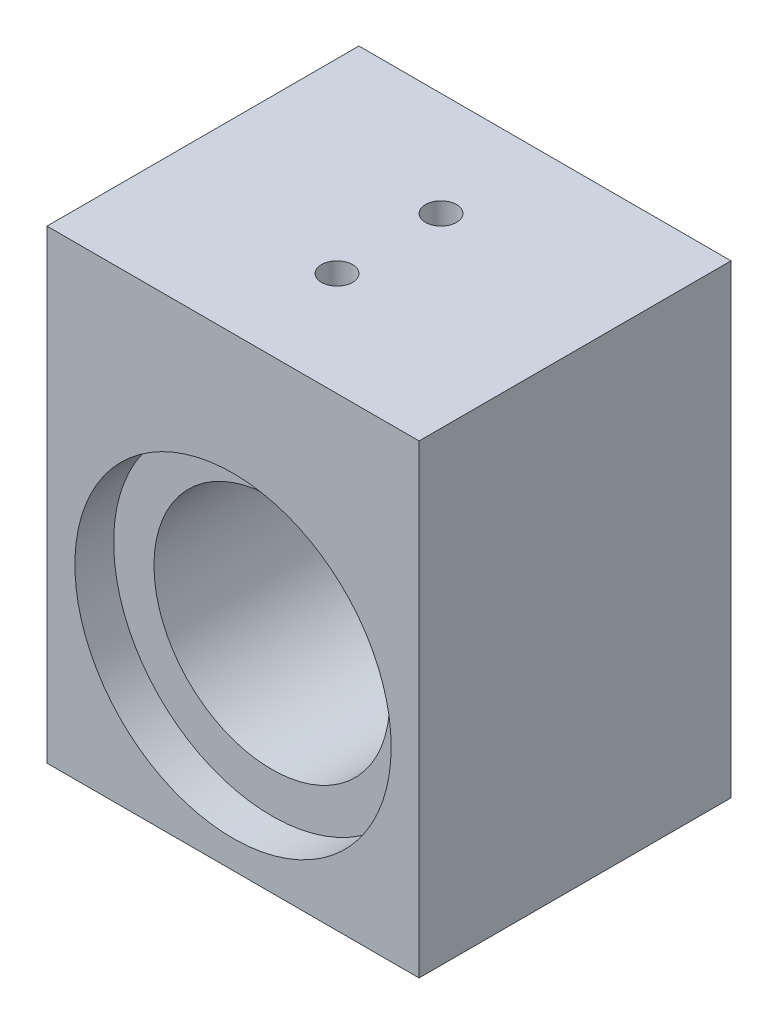
ISO-10303-21;
HEADER;
FILE_DESCRIPTION(('STEP AP214'),'2;1');
FILE_NAME('part.step','',(''),(''),'','','');
FILE_SCHEMA(('AUTOMOTIVE_DESIGN { 1 0 10303 214 1 1 1 1 }'));
ENDSEC;
DATA;
#1=APPLICATION_CONTEXT('core data for automotive mechanical design processes');
#2=APPLICATION_PROTOCOL_DEFINITION('international standard','automotive_design',2000,#1);
#3=PRODUCT_CONTEXT('',#1,'mechanical');
#4=PRODUCT('Part','Part','',(#3));
#5=PRODUCT_RELATED_PRODUCT_CATEGORY('part','',(#4));
#6=PRODUCT_DEFINITION_FORMATION('','',#4);
#7=PRODUCT_DEFINITION_CONTEXT('part definition',#1,'design');
#8=PRODUCT_DEFINITION('design','',#6,#7);
#9=PRODUCT_DEFINITION_SHAPE('','',#8);
#10=(LENGTH_UNIT() NAMED_UNIT(*) SI_UNIT(.MILLI.,.METRE.));
#11=(NAMED_UNIT(*) PLANE_ANGLE_UNIT() SI_UNIT($,.RADIAN.));
#12=(NAMED_UNIT(*) SI_UNIT($,.STERADIAN.) SOLID_ANGLE_UNIT());
#13=UNCERTAINTY_MEASURE_WITH_UNIT(LENGTH_MEASURE(1.E-05),#10,'distance_accuracy_value','');
#14=(GEOMETRIC_REPRESENTATION_CONTEXT(3) GLOBAL_UNCERTAINTY_ASSIGNED_CONTEXT((#13)) GLOBAL_UNIT_ASSIGNED_CONTEXT((#10,
#11,#12)) REPRESENTATION_CONTEXT('',''));
#15=CARTESIAN_POINT('',(0.,0.,0.));
#16=DIRECTION('',(0.,0.,1.));
#17=DIRECTION('',(1.,0.,0.));
#18=AXIS2_PLACEMENT_3D('',#15,#16,#17);
#19=CARTESIAN_POINT('',(7.62,7.62,-13.6499893040251));
#20=DIRECTION('',(0.,0.,1.));
#21=DIRECTION('',(1.,0.,0.));
#22=AXIS2_PLACEMENT_3D('',#19,#20,#21);
#23=CYLINDRICAL_SURFACE('',#22,4.826);
#24=CARTESIAN_POINT('',(7.62,7.62,3.175));
#25=DIRECTION('',(0.,0.,-1.));
#26=DIRECTION('',(-1.,0.,0.));
#27=AXIS2_PLACEMENT_3D('',#24,#25,#26);
#28=CIRCLE('',#27,4.826);
#29=CARTESIAN_POINT('',(12.446,7.62,3.175));
#30=VERTEX_POINT('',#29);
#31=EDGE_CURVE('E120',#30,#30,#28,.F.);
#32=CARTESIAN_POINT('',(7.62,7.62,11.1887));
#33=DIRECTION('',(0.,0.,1.));
#34=DIRECTION('',(1.,0.,0.));
#35=AXIS2_PLACEMENT_3D('',#32,#33,#34);
#36=CIRCLE('',#35,4.826);
#37=CARTESIAN_POINT('',(12.446,7.62,11.1887));
#38=VERTEX_POINT('',#37);
#39=EDGE_CURVE('E38',#38,#38,#36,.F.);
#40=CARTESIAN_POINT('',(12.446,7.62,3.175));
#41=CARTESIAN_POINT('',(12.446,7.62,3.25847604166667));
#42=CARTESIAN_POINT('',(12.446,7.62,3.34195208333333));
#43=CARTESIAN_POINT('',(12.446,7.62,3.50890416666667));
#44=CARTESIAN_POINT('',(12.446,7.62,3.59238020833333));
#45=CARTESIAN_POINT('',(12.446,7.62,3.75933229166667));
#46=CARTESIAN_POINT('',(12.446,7.62,3.84280833333333));
#47=CARTESIAN_POINT('',(12.446,7.62,4.00976041666667));
#48=CARTESIAN_POINT('',(12.446,7.62,4.09323645833333));
#49=CARTESIAN_POINT('',(12.446,7.62,4.26018854166667));
#50=CARTESIAN_POINT('',(12.446,7.62,4.34366458333333));
#51=CARTESIAN_POINT('',(12.446,7.62,4.51061666666666));
#52=CARTESIAN_POINT('',(12.446,7.62,4.59409270833333));
#53=CARTESIAN_POINT('',(12.446,7.62,4.76104479166666));
#54=CARTESIAN_POINT('',(12.446,7.62,4.84452083333333));
#55=CARTESIAN_POINT('',(12.446,7.62,5.01147291666666));
#56=CARTESIAN_POINT('',(12.446,7.62,5.09494895833333));
#57=CARTESIAN_POINT('',(12.446,7.62,5.26190104166666));
#58=CARTESIAN_POINT('',(12.446,7.62,5.34537708333333));
#59=CARTESIAN_POINT('',(12.446,7.62,5.51232916666667));
#60=CARTESIAN_POINT('',(12.446,7.62,5.59580520833333));
#61=CARTESIAN_POINT('',(12.446,7.62,5.76275729166667));
#62=CARTESIAN_POINT('',(12.446,7.62,5.84623333333333));
#63=CARTESIAN_POINT('',(12.446,7.62,6.01318541666667));
#64=CARTESIAN_POINT('',(12.446,7.62,6.09666145833333));
#65=CARTESIAN_POINT('',(12.446,7.62,6.26361354166666));
#66=CARTESIAN_POINT('',(12.446,7.62,6.34708958333333));
#67=CARTESIAN_POINT('',(12.446,7.62,6.51404166666666));
#68=CARTESIAN_POINT('',(12.446,7.62,6.59751770833333));
#69=CARTESIAN_POINT('',(12.446,7.62,6.76446979166666));
#70=CARTESIAN_POINT('',(12.446,7.62,6.84794583333333));
#71=CARTESIAN_POINT('',(12.446,7.62,7.01489791666666));
#72=CARTESIAN_POINT('',(12.446,7.62,7.09837395833333));
#73=CARTESIAN_POINT('',(12.446,7.62,7.26532604166666));
#74=CARTESIAN_POINT('',(12.446,7.62,7.34880208333333));
#75=CARTESIAN_POINT('',(12.446,7.62,7.51575416666667));
#76=CARTESIAN_POINT('',(12.446,7.62,7.59923020833333));
#77=CARTESIAN_POINT('',(12.446,7.62,7.76618229166667));
#78=CARTESIAN_POINT('',(12.446,7.62,7.84965833333333));
#79=CARTESIAN_POINT('',(12.446,7.62,8.01661041666667));
#80=CARTESIAN_POINT('',(12.446,7.62,8.10008645833333));
#81=CARTESIAN_POINT('',(12.446,7.62,8.26703854166667));
#82=CARTESIAN_POINT('',(12.446,7.62,8.35051458333333));
#83=CARTESIAN_POINT('',(12.446,7.62,8.51746666666667));
#84=CARTESIAN_POINT('',(12.446,7.62,8.60094270833333));
#85=CARTESIAN_POINT('',(12.446,7.62,8.76789479166666));
#86=CARTESIAN_POINT('',(12.446,7.62,8.85137083333333));
#87=CARTESIAN_POINT('',(12.446,7.62,9.01832291666667));
#88=CARTESIAN_POINT('',(12.446,7.62,9.10179895833333));
#89=CARTESIAN_POINT('',(12.446,7.62,9.26875104166666));
#90=CARTESIAN_POINT('',(12.446,7.62,9.35222708333333));
#91=CARTESIAN_POINT('',(12.446,7.62,9.51917916666667));
#92=CARTESIAN_POINT('',(12.446,7.62,9.60265520833333));
#93=CARTESIAN_POINT('',(12.446,7.62,9.76960729166666));
#94=CARTESIAN_POINT('',(12.446,7.62,9.85308333333333));
#95=CARTESIAN_POINT('',(12.446,7.62,10.0200354166667));
#96=CARTESIAN_POINT('',(12.446,7.62,10.1035114583333));
#97=CARTESIAN_POINT('',(12.446,7.62,10.2704635416667));
#98=CARTESIAN_POINT('',(12.446,7.62,10.3539395833333));
#99=CARTESIAN_POINT('',(12.446,7.62,10.5208916666667));
#100=CARTESIAN_POINT('',(12.446,7.62,10.6043677083333));
#101=CARTESIAN_POINT('',(12.446,7.62,10.7713197916667));
#102=CARTESIAN_POINT('',(12.446,7.62,10.8547958333333));
#103=CARTESIAN_POINT('',(12.446,7.62,11.0217479166667));
#104=CARTESIAN_POINT('',(12.446,7.62,11.1052239583333));
#105=CARTESIAN_POINT('',(12.446,7.62,11.1887));
#106=B_SPLINE_CURVE_WITH_KNOTS('',3,(#40,#41,#42,#43,#44,#45,#46,#47,#48,#49,#50,#51,#52,#53,
#54,#55,#56,#57,#58,#59,#60,#61,#62,#63,#64,#65,#66,#67,#68,#69,#70,#71,#72,#73,#74,#75,#76,#77,
#78,#79,#80,#81,#82,#83,#84,#85,#86,#87,#88,#89,#90,#91,#92,#93,#94,#95,#96,#97,#98,#99,#100,
#101,#102,#103,#104,#105),.UNSPECIFIED.,.F.,.F.,(4,2,2,2,2,2,2,2,2,2,2,2,2,2,2,2,2,2,2,2,2,2,2,
2,2,2,2,2,2,2,2,2,4),(0.,0.250428125,0.500856250000001,0.751284375000001,1.0017125,1.252140625,
1.50256875,1.752996875,2.003425,2.253853125,2.50428125,2.754709375,3.0051375,3.255565625,
3.50599375,3.756421875,4.00685,4.257278125,4.50770625,4.758134375,5.0085625,5.258990625,
5.50941875,5.759846875,6.010275,6.260703125,6.51113125,6.761559375,7.0119875,7.262415625,
7.51284375,7.763271875,8.0137),.UNSPECIFIED.);
#107=EDGE_CURVE('BSEAM34',#30,#38,#106,.T.);
#108=ORIENTED_EDGE('',*,*,#31,.F.);
#109=ORIENTED_EDGE('',*,*,#39,.F.);
#110=ORIENTED_EDGE('',*,*,#107,.T.);
#111=ORIENTED_EDGE('',*,*,#107,.F.);
#112=EDGE_LOOP('',(#108,#110,#109,#111));
#113=FACE_BOUND('',#112,.T.);
#114=ADVANCED_FACE('F34',(#113),#23,.F.);
#115=CARTESIAN_POINT('',(0.,0.,12.7762));
#116=DIRECTION('',(0.,0.,-1.));
#117=DIRECTION('',(-1.,0.,0.));
#118=AXIS2_PLACEMENT_3D('',#115,#116,#117);
#119=PLANE('',#118);
#120=CARTESIAN_POINT('',(7.62,7.62,12.7762));
#121=DIRECTION('',(0.,0.,1.));
#122=DIRECTION('',(1.,0.,0.));
#123=AXIS2_PLACEMENT_3D('',#120,#121,#122);
#124=CIRCLE('',#123,6.477);
#125=CARTESIAN_POINT('',(14.097,7.62,12.7762));
#126=VERTEX_POINT('',#125);
#127=EDGE_CURVE('E123',#126,#126,#124,.T.);
#128=ORIENTED_EDGE('',*,*,#127,.F.);
#129=EDGE_LOOP('',(#128));
#130=FACE_BOUND('',#129,.T.);
#131=DIRECTION('',(0.,-1.,0.));
#132=VECTOR('',#131,1.);
#133=CARTESIAN_POINT('',(0.,0.,12.7762));
#134=LINE('',#133,#132);
#135=CARTESIAN_POINT('',(0.,19.05,12.7762));
#136=VERTEX_POINT('',#135);
#137=CARTESIAN_POINT('',(0.,0.,12.7762));
#138=VERTEX_POINT('',#137);
#139=EDGE_CURVE('E87',#136,#138,#134,.T.);
#140=ORIENTED_EDGE('',*,*,#139,.T.);
#141=DIRECTION('',(1.,0.,0.));
#142=VECTOR('',#141,1.);
#143=CARTESIAN_POINT('',(0.,0.,12.7762));
#144=LINE('',#143,#142);
#145=CARTESIAN_POINT('',(15.24,0.,12.7762));
#146=VERTEX_POINT('',#145);
#147=EDGE_CURVE('E82',#138,#146,#144,.T.);
#148=ORIENTED_EDGE('',*,*,#147,.T.);
#149=DIRECTION('',(0.,1.,0.));
#150=VECTOR('',#149,1.);
#151=CARTESIAN_POINT('',(15.24,0.,12.7762));
#152=LINE('',#151,#150);
#153=CARTESIAN_POINT('',(15.24,19.05,12.7762));
#154=VERTEX_POINT('',#153);
#155=EDGE_CURVE('E85',#146,#154,#152,.T.);
#156=ORIENTED_EDGE('',*,*,#155,.T.);
#157=DIRECTION('',(-1.,0.,0.));
#158=VECTOR('',#157,1.);
#159=CARTESIAN_POINT('',(0.,19.05,12.7762));
#160=LINE('',#159,#158);
#161=EDGE_CURVE('E52',#154,#136,#160,.T.);
#162=ORIENTED_EDGE('',*,*,#161,.T.);
#163=EDGE_LOOP('',(#140,#148,#156,#162));
#164=FACE_BOUND('',#163,.T.);
#165=ADVANCED_FACE('F83',(#130,#164),#119,.F.);
#166=CARTESIAN_POINT('',(0.,0.,0.));
#167=DIRECTION('',(0.,0.,-1.));
#168=DIRECTION('',(-1.,0.,0.));
#169=AXIS2_PLACEMENT_3D('',#166,#167,#168);
#170=PLANE('',#169);
#171=DIRECTION('',(0.,-1.,0.));
#172=VECTOR('',#171,1.);
#173=CARTESIAN_POINT('',(0.,0.,0.));
#174=LINE('',#173,#172);
#175=CARTESIAN_POINT('',(0.,19.05,0.));
#176=VERTEX_POINT('',#175);
#177=CARTESIAN_POINT('',(0.,0.,0.));
#178=VERTEX_POINT('',#177);
#179=EDGE_CURVE('E100',#176,#178,#174,.T.);
#180=ORIENTED_EDGE('',*,*,#179,.F.);
#181=DIRECTION('',(-1.,0.,0.));
#182=VECTOR('',#181,1.);
#183=CARTESIAN_POINT('',(0.,19.05,0.));
#184=LINE('',#183,#182);
#185=CARTESIAN_POINT('',(15.24,19.05,0.));
#186=VERTEX_POINT('',#185);
#187=EDGE_CURVE('E75',#186,#176,#184,.T.);
#188=ORIENTED_EDGE('',*,*,#187,.F.);
#189=DIRECTION('',(0.,1.,0.));
#190=VECTOR('',#189,1.);
#191=CARTESIAN_POINT('',(15.24,0.,0.));
#192=LINE('',#191,#190);
#193=CARTESIAN_POINT('',(15.24,0.,0.));
#194=VERTEX_POINT('',#193);
#195=EDGE_CURVE('E69',#194,#186,#192,.T.);
#196=ORIENTED_EDGE('',*,*,#195,.F.);
#197=DIRECTION('',(1.,0.,0.));
#198=VECTOR('',#197,1.);
#199=CARTESIAN_POINT('',(0.,0.,0.));
#200=LINE('',#199,#198);
#201=EDGE_CURVE('E91',#178,#194,#200,.T.);
#202=ORIENTED_EDGE('',*,*,#201,.F.);
#203=EDGE_LOOP('',(#180,#188,#196,#202));
#204=FACE_BOUND('',#203,.T.);
#205=CARTESIAN_POINT('',(7.62,7.62,0.));
#206=DIRECTION('',(0.,0.,1.));
#207=DIRECTION('',(1.,0.,0.));
#208=AXIS2_PLACEMENT_3D('',#205,#206,#207);
#209=CIRCLE('',#208,3.302);
#210=CARTESIAN_POINT('',(10.922,7.62,0.));
#211=VERTEX_POINT('',#210);
#212=EDGE_CURVE('E103',#211,#211,#209,.T.);
#213=ORIENTED_EDGE('',*,*,#212,.T.);
#214=EDGE_LOOP('',(#213));
#215=FACE_BOUND('',#214,.T.);
#216=ADVANCED_FACE('F111',(#204,#215),#170,.T.);
#217=CARTESIAN_POINT('',(0.,0.,12.7762));
#218=DIRECTION('',(1.,0.,0.));
#219=DIRECTION('',(0.,0.,-1.));
#220=AXIS2_PLACEMENT_3D('',#217,#218,#219);
#221=PLANE('',#220);
#222=ORIENTED_EDGE('',*,*,#179,.T.);
#223=DIRECTION('',(0.,0.,-1.));
#224=VECTOR('',#223,1.);
#225=CARTESIAN_POINT('',(0.,0.,12.7762));
#226=LINE('',#225,#224);
#227=EDGE_CURVE('E12',#138,#178,#226,.T.);
#228=ORIENTED_EDGE('',*,*,#227,.F.);
#229=ORIENTED_EDGE('',*,*,#139,.F.);
#230=DIRECTION('',(0.,0.,-1.));
#231=VECTOR('',#230,1.);
#232=CARTESIAN_POINT('',(0.,19.05,12.7762));
#233=LINE('',#232,#231);
#234=EDGE_CURVE('E96',#136,#176,#233,.T.);
#235=ORIENTED_EDGE('',*,*,#234,.T.);
#236=EDGE_LOOP('',(#222,#228,#229,#235));
#237=FACE_BOUND('',#236,.T.);
#238=ADVANCED_FACE('F36',(#237),#221,.F.);
#239=CARTESIAN_POINT('',(0.,0.,12.7762));
#240=DIRECTION('',(0.,1.,0.));
#241=DIRECTION('',(-1.,0.,0.));
#242=AXIS2_PLACEMENT_3D('',#239,#240,#241);
#243=PLANE('',#242);
#244=ORIENTED_EDGE('',*,*,#201,.T.);
#245=DIRECTION('',(0.,0.,-1.));
#246=VECTOR('',#245,1.);
#247=CARTESIAN_POINT('',(15.24,0.,12.7762));
#248=LINE('',#247,#246);
#249=EDGE_CURVE('E44',#146,#194,#248,.T.);
#250=ORIENTED_EDGE('',*,*,#249,.F.);
#251=ORIENTED_EDGE('',*,*,#147,.F.);
#252=ORIENTED_EDGE('',*,*,#227,.T.);
#253=EDGE_LOOP('',(#244,#250,#251,#252));
#254=FACE_BOUND('',#253,.T.);
#255=ADVANCED_FACE('F90',(#254),#243,.F.);
#256=CARTESIAN_POINT('',(15.24,0.,12.7762));
#257=DIRECTION('',(-1.,0.,0.));
#258=DIRECTION('',(0.,0.,1.));
#259=AXIS2_PLACEMENT_3D('',#256,#257,#258);
#260=PLANE('',#259);
#261=ORIENTED_EDGE('',*,*,#195,.T.);
#262=DIRECTION('',(0.,0.,-1.));
#263=VECTOR('',#262,1.);
#264=CARTESIAN_POINT('',(15.24,19.05,12.7762));
#265=LINE('',#264,#263);
#266=EDGE_CURVE('E92',#154,#186,#265,.T.);
#267=ORIENTED_EDGE('',*,*,#266,.F.);
#268=ORIENTED_EDGE('',*,*,#155,.F.);
#269=ORIENTED_EDGE('',*,*,#249,.T.);
#270=EDGE_LOOP('',(#261,#267,#268,#269));
#271=FACE_BOUND('',#270,.T.);
#272=ADVANCED_FACE('F94',(#271),#260,.F.);
#273=CARTESIAN_POINT('',(0.,19.05,12.7762));
#274=DIRECTION('',(0.,-1.,0.));
#275=DIRECTION('',(0.,0.,-1.));
#276=AXIS2_PLACEMENT_3D('',#273,#274,#275);
#277=PLANE('',#276);
#278=CARTESIAN_POINT('',(7.62,19.05,4.25873333333333));
#279=DIRECTION('',(0.,1.,0.));
#280=DIRECTION('',(0.,0.,1.));
#281=AXIS2_PLACEMENT_3D('',#278,#279,#280);
#282=CIRCLE('',#281,0.635000000000002);
#283=CARTESIAN_POINT('',(7.62,19.05,4.89373333333334));
#284=VERTEX_POINT('',#283);
#285=EDGE_CURVE('E136',#284,#284,#282,.T.);
#286=ORIENTED_EDGE('',*,*,#285,.F.);
#287=EDGE_LOOP('',(#286));
#288=FACE_BOUND('',#287,.T.);
#289=CARTESIAN_POINT('',(7.62,19.05,8.51746666666667));
#290=DIRECTION('',(0.,1.,0.));
#291=DIRECTION('',(0.,0.,1.));
#292=AXIS2_PLACEMENT_3D('',#289,#290,#291);
#293=CIRCLE('',#292,0.635000000000002);
#294=CARTESIAN_POINT('',(7.62,19.05,9.15246666666667));
#295=VERTEX_POINT('',#294);
#296=EDGE_CURVE('E130',#295,#295,#293,.T.);
#297=ORIENTED_EDGE('',*,*,#296,.F.);
#298=EDGE_LOOP('',(#297));
#299=FACE_BOUND('',#298,.T.);
#300=ORIENTED_EDGE('',*,*,#187,.T.);
#301=ORIENTED_EDGE('',*,*,#234,.F.);
#302=ORIENTED_EDGE('',*,*,#161,.F.);
#303=ORIENTED_EDGE('',*,*,#266,.T.);
#304=EDGE_LOOP('',(#300,#301,#302,#303));
#305=FACE_BOUND('',#304,.T.);
#306=ADVANCED_FACE('F108',(#288,#299,#305),#277,.F.);
#307=CARTESIAN_POINT('',(7.62,7.62,12.7762));
#308=DIRECTION('',(0.,0.,-1.));
#309=DIRECTION('',(-1.,0.,0.));
#310=AXIS2_PLACEMENT_3D('',#307,#308,#309);
#311=CYLINDRICAL_SURFACE('',#310,3.302);
#312=CARTESIAN_POINT('',(7.62,7.62,3.175));
#313=DIRECTION('',(0.,0.,-1.));
#314=DIRECTION('',(-1.,0.,0.));
#315=AXIS2_PLACEMENT_3D('',#312,#313,#314);
#316=CIRCLE('',#315,3.302);
#317=CARTESIAN_POINT('',(4.318,7.62,3.175));
#318=VERTEX_POINT('',#317);
#319=EDGE_CURVE('E117',#318,#318,#316,.F.);
#320=ORIENTED_EDGE('',*,*,#319,.T.);
#321=EDGE_LOOP('',(#320));
#322=FACE_BOUND('',#321,.T.);
#323=ORIENTED_EDGE('',*,*,#212,.F.);
#324=EDGE_LOOP('',(#323));
#325=FACE_BOUND('',#324,.T.);
#326=ADVANCED_FACE('F153',(#322,#325),#311,.F.);
#327=CARTESIAN_POINT('',(0.,0.,3.175));
#328=DIRECTION('',(0.,0.,-1.));
#329=DIRECTION('',(-1.,0.,0.));
#330=AXIS2_PLACEMENT_3D('',#327,#328,#329);
#331=PLANE('',#330);
#332=ORIENTED_EDGE('',*,*,#31,.T.);
#333=EDGE_LOOP('',(#332));
#334=FACE_BOUND('',#333,.T.);
#335=ORIENTED_EDGE('',*,*,#319,.F.);
#336=EDGE_LOOP('',(#335));
#337=FACE_BOUND('',#336,.T.);
#338=ADVANCED_FACE('F184',(#334,#337),#331,.F.);
#339=CARTESIAN_POINT('',(7.62,7.62,11.1887));
#340=DIRECTION('',(0.,0.,1.));
#341=DIRECTION('',(1.,0.,0.));
#342=AXIS2_PLACEMENT_3D('',#339,#340,#341);
#343=PLANE('',#342);
#344=CARTESIAN_POINT('',(7.62,7.62,11.1887));
#345=DIRECTION('',(0.,0.,1.));
#346=DIRECTION('',(1.,0.,0.));
#347=AXIS2_PLACEMENT_3D('',#344,#345,#346);
#348=CIRCLE('',#347,6.477);
#349=CARTESIAN_POINT('',(14.097,7.62,11.1887));
#350=VERTEX_POINT('',#349);
#351=EDGE_CURVE('E126',#350,#350,#348,.T.);
#352=ORIENTED_EDGE('',*,*,#351,.T.);
#353=EDGE_LOOP('',(#352));
#354=FACE_BOUND('',#353,.T.);
#355=ORIENTED_EDGE('',*,*,#39,.T.);
#356=EDGE_LOOP('',(#355));
#357=FACE_BOUND('',#356,.T.);
#358=ADVANCED_FACE('F168',(#354,#357),#343,.T.);
#359=CARTESIAN_POINT('',(7.62,7.62,11.1887));
#360=DIRECTION('',(0.,0.,1.));
#361=DIRECTION('',(1.,0.,0.));
#362=AXIS2_PLACEMENT_3D('',#359,#360,#361);
#363=CYLINDRICAL_SURFACE('',#362,6.477);
#364=ORIENTED_EDGE('',*,*,#351,.F.);
#365=EDGE_LOOP('',(#364));
#366=FACE_BOUND('',#365,.T.);
#367=ORIENTED_EDGE('',*,*,#127,.T.);
#368=EDGE_LOOP('',(#367));
#369=FACE_BOUND('',#368,.T.);
#370=ADVANCED_FACE('F159',(#366,#369),#363,.F.);
#371=CARTESIAN_POINT('',(7.62,16.51,8.51746666666667));
#372=DIRECTION('',(0.,1.,0.));
#373=DIRECTION('',(0.,0.,1.));
#374=AXIS2_PLACEMENT_3D('',#371,#372,#373);
#375=CYLINDRICAL_SURFACE('',#374,0.635000000000002);
#376=CARTESIAN_POINT('',(7.62,16.51,8.51746666666667));
#377=DIRECTION('',(0.,1.,0.));
#378=DIRECTION('',(0.,0.,1.));
#379=AXIS2_PLACEMENT_3D('',#376,#377,#378);
#380=CIRCLE('',#379,0.635000000000002);
#381=CARTESIAN_POINT('',(7.62,16.51,9.15246666666667));
#382=VERTEX_POINT('',#381);
#383=EDGE_CURVE('E127',#382,#382,#380,.T.);
#384=ORIENTED_EDGE('',*,*,#383,.F.);
#385=EDGE_LOOP('',(#384));
#386=FACE_BOUND('',#385,.T.);
#387=ORIENTED_EDGE('',*,*,#296,.T.);
#388=EDGE_LOOP('',(#387));
#389=FACE_BOUND('',#388,.T.);
#390=ADVANCED_FACE('F157',(#386,#389),#375,.F.);
#391=CARTESIAN_POINT('',(7.62,16.51,8.51746666666667));
#392=DIRECTION('',(0.,1.,0.));
#393=DIRECTION('',(0.,0.,1.));
#394=AXIS2_PLACEMENT_3D('',#391,#392,#393);
#395=PLANE('',#394);
#396=ORIENTED_EDGE('',*,*,#383,.T.);
#397=EDGE_LOOP('',(#396));
#398=FACE_BOUND('',#397,.T.);
#399=ADVANCED_FACE('F147',(#398),#395,.T.);
#400=CARTESIAN_POINT('',(7.62,16.51,4.25873333333333));
#401=DIRECTION('',(0.,1.,0.));
#402=DIRECTION('',(0.,0.,1.));
#403=AXIS2_PLACEMENT_3D('',#400,#401,#402);
#404=CYLINDRICAL_SURFACE('',#403,0.635000000000002);
#405=CARTESIAN_POINT('',(7.62,16.51,4.25873333333333));
#406=DIRECTION('',(0.,1.,0.));
#407=DIRECTION('',(0.,0.,1.));
#408=AXIS2_PLACEMENT_3D('',#405,#406,#407);
#409=CIRCLE('',#408,0.635000000000002);
#410=CARTESIAN_POINT('',(7.62,16.51,4.89373333333334));
#411=VERTEX_POINT('',#410);
#412=EDGE_CURVE('E133',#411,#411,#409,.T.);
#413=ORIENTED_EDGE('',*,*,#412,.F.);
#414=EDGE_LOOP('',(#413));
#415=FACE_BOUND('',#414,.T.);
#416=ORIENTED_EDGE('',*,*,#285,.T.);
#417=EDGE_LOOP('',(#416));
#418=FACE_BOUND('',#417,.T.);
#419=ADVANCED_FACE('F144',(#415,#418),#404,.F.);
#420=CARTESIAN_POINT('',(7.62,16.51,4.25873333333333));
#421=DIRECTION('',(0.,1.,0.));
#422=DIRECTION('',(0.,0.,1.));
#423=AXIS2_PLACEMENT_3D('',#420,#421,#422);
#424=PLANE('',#423);
#425=ORIENTED_EDGE('',*,*,#412,.T.);
#426=EDGE_LOOP('',(#425));
#427=FACE_BOUND('',#426,.T.);
#428=ADVANCED_FACE('F142',(#427),#424,.T.);
#429=CLOSED_SHELL('',(#114,#165,#216,#238,#255,#272,#306,#326,#338,#358,#370,#390,#399,#419,#428));
#430=MANIFOLD_SOLID_BREP('B2',#429);
#431=ADVANCED_BREP_SHAPE_REPRESENTATION('',(#18,#430),#14);
#432=SHAPE_DEFINITION_REPRESENTATION(#9,#431);
ENDSEC;
END-ISO-10303-21;
